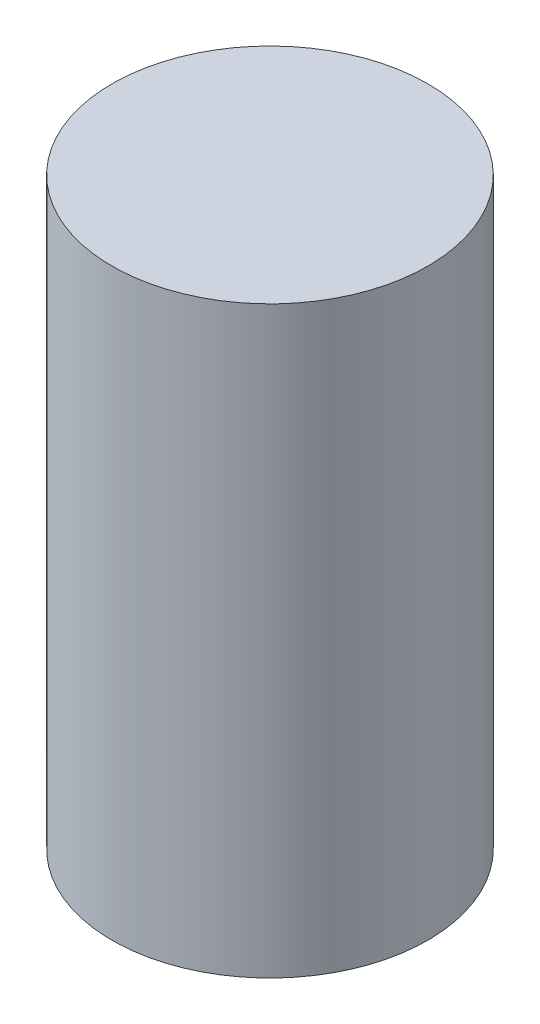
ISO-10303-21;
HEADER;
FILE_DESCRIPTION(('STEP AP214'),'2;1');
FILE_NAME('part.step','',(''),(''),'','','');
FILE_SCHEMA(('AUTOMOTIVE_DESIGN { 1 0 10303 214 1 1 1 1 }'));
ENDSEC;
DATA;
#1=APPLICATION_CONTEXT('core data for automotive mechanical design processes');
#2=APPLICATION_PROTOCOL_DEFINITION('international standard','automotive_design',2000,#1);
#3=PRODUCT_CONTEXT('',#1,'mechanical');
#4=PRODUCT('Part','Part','',(#3));
#5=PRODUCT_RELATED_PRODUCT_CATEGORY('part','',(#4));
#6=PRODUCT_DEFINITION_FORMATION('','',#4);
#7=PRODUCT_DEFINITION_CONTEXT('part definition',#1,'design');
#8=PRODUCT_DEFINITION('design','',#6,#7);
#9=PRODUCT_DEFINITION_SHAPE('','',#8);
#10=(LENGTH_UNIT() NAMED_UNIT(*) SI_UNIT(.MILLI.,.METRE.));
#11=(NAMED_UNIT(*) PLANE_ANGLE_UNIT() SI_UNIT($,.RADIAN.));
#12=(NAMED_UNIT(*) SI_UNIT($,.STERADIAN.) SOLID_ANGLE_UNIT());
#13=UNCERTAINTY_MEASURE_WITH_UNIT(LENGTH_MEASURE(1.E-05),#10,'distance_accuracy_value','');
#14=(GEOMETRIC_REPRESENTATION_CONTEXT(3) GLOBAL_UNCERTAINTY_ASSIGNED_CONTEXT((#13)) GLOBAL_UNIT_ASSIGNED_CONTEXT((#10,
#11,#12)) REPRESENTATION_CONTEXT('',''));
#15=CARTESIAN_POINT('',(0.,0.,0.));
#16=DIRECTION('',(0.,0.,1.));
#17=DIRECTION('',(1.,0.,0.));
#18=AXIS2_PLACEMENT_3D('',#15,#16,#17);
#19=CARTESIAN_POINT('',(0.,122.,0.));
#20=DIRECTION('',(0.,-1.,0.));
#21=DIRECTION('',(0.,0.,-1.));
#22=AXIS2_PLACEMENT_3D('',#19,#20,#21);
#23=CYLINDRICAL_SURFACE('',#22,33.);
#24=CARTESIAN_POINT('',(0.,122.,0.));
#25=DIRECTION('',(0.,1.,0.));
#26=DIRECTION('',(0.,0.,1.));
#27=AXIS2_PLACEMENT_3D('',#24,#25,#26);
#28=CIRCLE('',#27,33.);
#29=CARTESIAN_POINT('',(0.,122.,-33.));
#30=VERTEX_POINT('',#29);
#31=EDGE_CURVE('E10',#30,#30,#28,.T.);
#32=CARTESIAN_POINT('',(0.,0.,0.));
#33=DIRECTION('',(0.,1.,0.));
#34=DIRECTION('',(0.,0.,1.));
#35=AXIS2_PLACEMENT_3D('',#32,#33,#34);
#36=CIRCLE('',#35,33.);
#37=CARTESIAN_POINT('',(0.,0.,-33.));
#38=VERTEX_POINT('',#37);
#39=EDGE_CURVE('E33',#38,#38,#36,.T.);
#40=CARTESIAN_POINT('',(0.,122.,-33.));
#41=CARTESIAN_POINT('',(0.,120.729166666667,-33.));
#42=CARTESIAN_POINT('',(0.,119.458333333333,-33.));
#43=CARTESIAN_POINT('',(0.,116.916666666667,-33.));
#44=CARTESIAN_POINT('',(0.,115.645833333333,-33.));
#45=CARTESIAN_POINT('',(0.,113.104166666667,-33.));
#46=CARTESIAN_POINT('',(0.,111.833333333333,-33.));
#47=CARTESIAN_POINT('',(0.,109.291666666667,-33.));
#48=CARTESIAN_POINT('',(0.,108.020833333333,-33.));
#49=CARTESIAN_POINT('',(0.,105.479166666667,-33.));
#50=CARTESIAN_POINT('',(0.,104.208333333333,-33.));
#51=CARTESIAN_POINT('',(0.,101.666666666667,-33.));
#52=CARTESIAN_POINT('',(0.,100.395833333333,-33.));
#53=CARTESIAN_POINT('',(0.,97.8541666666667,-33.));
#54=CARTESIAN_POINT('',(0.,96.5833333333333,-33.));
#55=CARTESIAN_POINT('',(0.,94.0416666666667,-33.));
#56=CARTESIAN_POINT('',(0.,92.7708333333333,-33.));
#57=CARTESIAN_POINT('',(0.,90.2291666666667,-33.));
#58=CARTESIAN_POINT('',(0.,88.9583333333333,-33.));
#59=CARTESIAN_POINT('',(0.,86.4166666666667,-33.));
#60=CARTESIAN_POINT('',(0.,85.1458333333333,-33.));
#61=CARTESIAN_POINT('',(0.,82.6041666666667,-33.));
#62=CARTESIAN_POINT('',(0.,81.3333333333333,-33.));
#63=CARTESIAN_POINT('',(0.,78.7916666666666,-33.));
#64=CARTESIAN_POINT('',(0.,77.5208333333333,-33.));
#65=CARTESIAN_POINT('',(0.,74.9791666666667,-33.));
#66=CARTESIAN_POINT('',(0.,73.7083333333333,-33.));
#67=CARTESIAN_POINT('',(0.,71.1666666666667,-33.));
#68=CARTESIAN_POINT('',(0.,69.8958333333333,-33.));
#69=CARTESIAN_POINT('',(0.,67.3541666666667,-33.));
#70=CARTESIAN_POINT('',(0.,66.0833333333333,-33.));
#71=CARTESIAN_POINT('',(0.,63.5416666666667,-33.));
#72=CARTESIAN_POINT('',(0.,62.2708333333333,-33.));
#73=CARTESIAN_POINT('',(0.,59.7291666666667,-33.));
#74=CARTESIAN_POINT('',(0.,58.4583333333333,-33.));
#75=CARTESIAN_POINT('',(0.,55.9166666666667,-33.));
#76=CARTESIAN_POINT('',(0.,54.6458333333333,-33.));
#77=CARTESIAN_POINT('',(0.,52.1041666666667,-33.));
#78=CARTESIAN_POINT('',(0.,50.8333333333333,-33.));
#79=CARTESIAN_POINT('',(0.,48.2916666666667,-33.));
#80=CARTESIAN_POINT('',(0.,47.0208333333333,-33.));
#81=CARTESIAN_POINT('',(0.,44.4791666666667,-33.));
#82=CARTESIAN_POINT('',(0.,43.2083333333333,-33.));
#83=CARTESIAN_POINT('',(0.,40.6666666666667,-33.));
#84=CARTESIAN_POINT('',(0.,39.3958333333333,-33.));
#85=CARTESIAN_POINT('',(0.,36.8541666666667,-33.));
#86=CARTESIAN_POINT('',(0.,35.5833333333333,-33.));
#87=CARTESIAN_POINT('',(0.,33.0416666666667,-33.));
#88=CARTESIAN_POINT('',(0.,31.7708333333333,-33.));
#89=CARTESIAN_POINT('',(0.,29.2291666666667,-33.));
#90=CARTESIAN_POINT('',(0.,27.9583333333333,-33.));
#91=CARTESIAN_POINT('',(0.,25.4166666666667,-33.));
#92=CARTESIAN_POINT('',(0.,24.1458333333333,-33.));
#93=CARTESIAN_POINT('',(0.,21.6041666666667,-33.));
#94=CARTESIAN_POINT('',(0.,20.3333333333333,-33.));
#95=CARTESIAN_POINT('',(0.,17.7916666666667,-33.));
#96=CARTESIAN_POINT('',(0.,16.5208333333333,-33.));
#97=CARTESIAN_POINT('',(0.,13.9791666666667,-33.));
#98=CARTESIAN_POINT('',(0.,12.7083333333333,-33.));
#99=CARTESIAN_POINT('',(0.,10.1666666666667,-33.));
#100=CARTESIAN_POINT('',(0.,8.89583333333333,-33.));
#101=CARTESIAN_POINT('',(0.,6.35416666666666,-33.));
#102=CARTESIAN_POINT('',(0.,5.08333333333332,-33.));
#103=CARTESIAN_POINT('',(0.,2.54166666666665,-33.));
#104=CARTESIAN_POINT('',(0.,1.27083333333332,-33.));
#105=CARTESIAN_POINT('',(0.,0.,-33.));
#106=B_SPLINE_CURVE_WITH_KNOTS('',3,(#40,#41,#42,#43,#44,#45,#46,#47,#48,#49,#50,#51,#52,#53,
#54,#55,#56,#57,#58,#59,#60,#61,#62,#63,#64,#65,#66,#67,#68,#69,#70,#71,#72,#73,#74,#75,#76,#77,
#78,#79,#80,#81,#82,#83,#84,#85,#86,#87,#88,#89,#90,#91,#92,#93,#94,#95,#96,#97,#98,#99,#100,
#101,#102,#103,#104,#105),.UNSPECIFIED.,.F.,.F.,(4,2,2,2,2,2,2,2,2,2,2,2,2,2,2,2,2,2,2,2,2,2,2,
2,2,2,2,2,2,2,2,2,4),(0.,3.81250000000001,7.62500000000001,11.4375,15.25,19.0625,22.875,26.6875,
30.5,34.3125,38.125,41.9375,45.75,49.5625,53.375,57.1875,61.,64.8125,68.625,72.4375,76.25,
80.0625,83.875,87.6875,91.5,95.3125,99.125,102.9375,106.75,110.5625,114.375,118.1875,122.),.UNSPECIFIED.);
#107=EDGE_CURVE('BSEAM30',#30,#38,#106,.T.);
#108=ORIENTED_EDGE('',*,*,#31,.F.);
#109=ORIENTED_EDGE('',*,*,#39,.T.);
#110=ORIENTED_EDGE('',*,*,#107,.T.);
#111=ORIENTED_EDGE('',*,*,#107,.F.);
#112=EDGE_LOOP('',(#108,#110,#109,#111));
#113=FACE_BOUND('',#112,.T.);
#114=ADVANCED_FACE('F30',(#113),#23,.T.);
#115=CARTESIAN_POINT('',(0.,122.,0.));
#116=DIRECTION('',(0.,1.,0.));
#117=DIRECTION('',(0.,0.,1.));
#118=AXIS2_PLACEMENT_3D('',#115,#116,#117);
#119=PLANE('',#118);
#120=ORIENTED_EDGE('',*,*,#31,.T.);
#121=EDGE_LOOP('',(#120));
#122=FACE_BOUND('',#121,.T.);
#123=ADVANCED_FACE('F45',(#122),#119,.T.);
#124=CARTESIAN_POINT('',(0.,0.,0.));
#125=DIRECTION('',(0.,1.,0.));
#126=DIRECTION('',(0.,0.,1.));
#127=AXIS2_PLACEMENT_3D('',#124,#125,#126);
#128=PLANE('',#127);
#129=ORIENTED_EDGE('',*,*,#39,.F.);
#130=EDGE_LOOP('',(#129));
#131=FACE_BOUND('',#130,.T.);
#132=ADVANCED_FACE('F43',(#131),#128,.F.);
#133=CLOSED_SHELL('',(#114,#123,#132));
#134=MANIFOLD_SOLID_BREP('B2',#133);
#135=ADVANCED_BREP_SHAPE_REPRESENTATION('',(#18,#134),#14);
#136=SHAPE_DEFINITION_REPRESENTATION(#9,#135);
ENDSEC;
END-ISO-10303-21;
